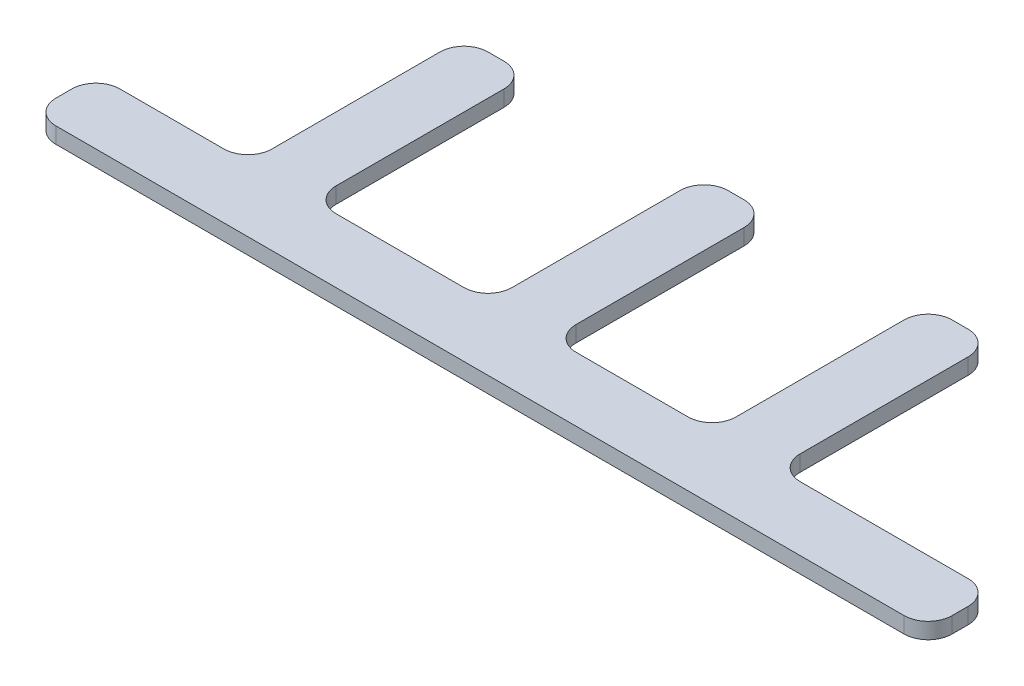
ISO-10303-21;
HEADER;
FILE_DESCRIPTION(('STEP AP214'),'2;1');
FILE_NAME('part.step','',(''),(''),'','','');
FILE_SCHEMA(('AUTOMOTIVE_DESIGN { 1 0 10303 214 1 1 1 1 }'));
ENDSEC;
DATA;
#1=APPLICATION_CONTEXT('core data for automotive mechanical design processes');
#2=APPLICATION_PROTOCOL_DEFINITION('international standard','automotive_design',2000,#1);
#3=PRODUCT_CONTEXT('',#1,'mechanical');
#4=PRODUCT('Part','Part','',(#3));
#5=PRODUCT_RELATED_PRODUCT_CATEGORY('part','',(#4));
#6=PRODUCT_DEFINITION_FORMATION('','',#4);
#7=PRODUCT_DEFINITION_CONTEXT('part definition',#1,'design');
#8=PRODUCT_DEFINITION('design','',#6,#7);
#9=PRODUCT_DEFINITION_SHAPE('','',#8);
#10=(LENGTH_UNIT() NAMED_UNIT(*) SI_UNIT(.MILLI.,.METRE.));
#11=(NAMED_UNIT(*) PLANE_ANGLE_UNIT() SI_UNIT($,.RADIAN.));
#12=(NAMED_UNIT(*) SI_UNIT($,.STERADIAN.) SOLID_ANGLE_UNIT());
#13=UNCERTAINTY_MEASURE_WITH_UNIT(LENGTH_MEASURE(1.E-05),#10,'distance_accuracy_value','');
#14=(GEOMETRIC_REPRESENTATION_CONTEXT(3) GLOBAL_UNCERTAINTY_ASSIGNED_CONTEXT((#13)) GLOBAL_UNIT_ASSIGNED_CONTEXT((#10,
#11,#12)) REPRESENTATION_CONTEXT('',''));
#15=CARTESIAN_POINT('',(0.,0.,0.));
#16=DIRECTION('',(0.,0.,1.));
#17=DIRECTION('',(1.,0.,0.));
#18=AXIS2_PLACEMENT_3D('',#15,#16,#17);
#19=CARTESIAN_POINT('',(32.,2.,-28.));
#20=DIRECTION('',(0.,-1.,0.));
#21=DIRECTION('',(0.,0.,-1.));
#22=AXIS2_PLACEMENT_3D('',#19,#20,#21);
#23=CYLINDRICAL_SURFACE('',#22,3.);
#24=CARTESIAN_POINT('',(32.,0.,-28.));
#25=DIRECTION('',(0.,1.,0.));
#26=DIRECTION('',(0.,0.,-1.));
#27=AXIS2_PLACEMENT_3D('',#24,#25,#26);
#28=CIRCLE('',#27,3.);
#29=CARTESIAN_POINT('',(35.,0.,-28.));
#30=VERTEX_POINT('',#29);
#31=CARTESIAN_POINT('',(32.,0.,-31.));
#32=VERTEX_POINT('',#31);
#33=EDGE_CURVE('E273',#30,#32,#28,.T.);
#34=ORIENTED_EDGE('',*,*,#33,.T.);
#35=DIRECTION('',(0.,-1.,0.));
#36=VECTOR('',#35,1.);
#37=CARTESIAN_POINT('',(32.,2.,-31.));
#38=LINE('',#37,#36);
#39=CARTESIAN_POINT('',(32.,2.,-31.));
#40=VERTEX_POINT('',#39);
#41=EDGE_CURVE('E11',#40,#32,#38,.T.);
#42=ORIENTED_EDGE('',*,*,#41,.F.);
#43=CARTESIAN_POINT('',(32.,2.,-28.));
#44=DIRECTION('',(0.,1.,0.));
#45=DIRECTION('',(0.,0.,-1.));
#46=AXIS2_PLACEMENT_3D('',#43,#44,#45);
#47=CIRCLE('',#46,3.);
#48=CARTESIAN_POINT('',(35.,2.,-28.));
#49=VERTEX_POINT('',#48);
#50=EDGE_CURVE('E335',#49,#40,#47,.T.);
#51=ORIENTED_EDGE('',*,*,#50,.F.);
#52=DIRECTION('',(0.,-1.,0.));
#53=VECTOR('',#52,1.);
#54=CARTESIAN_POINT('',(35.,2.,-28.));
#55=LINE('',#54,#53);
#56=EDGE_CURVE('E269',#49,#30,#55,.T.);
#57=ORIENTED_EDGE('',*,*,#56,.T.);
#58=EDGE_LOOP('',(#34,#42,#51,#57));
#59=FACE_BOUND('',#58,.T.);
#60=ADVANCED_FACE('F33',(#59),#23,.T.);
#61=CARTESIAN_POINT('',(30.,2.,-31.));
#62=DIRECTION('',(0.,0.,1.));
#63=DIRECTION('',(1.,0.,0.));
#64=AXIS2_PLACEMENT_3D('',#61,#62,#63);
#65=PLANE('',#64);
#66=DIRECTION('',(-1.,0.,0.));
#67=VECTOR('',#66,1.);
#68=CARTESIAN_POINT('',(30.,0.,-31.));
#69=LINE('',#68,#67);
#70=CARTESIAN_POINT('',(30.,0.,-31.));
#71=VERTEX_POINT('',#70);
#72=EDGE_CURVE('E276',#32,#71,#69,.T.);
#73=ORIENTED_EDGE('',*,*,#72,.T.);
#74=DIRECTION('',(0.,-1.,0.));
#75=VECTOR('',#74,1.);
#76=CARTESIAN_POINT('',(30.,2.,-31.));
#77=LINE('',#76,#75);
#78=CARTESIAN_POINT('',(30.,2.,-31.));
#79=VERTEX_POINT('',#78);
#80=EDGE_CURVE('E41',#79,#71,#77,.T.);
#81=ORIENTED_EDGE('',*,*,#80,.F.);
#82=DIRECTION('',(-1.,0.,0.));
#83=VECTOR('',#82,1.);
#84=CARTESIAN_POINT('',(30.,2.,-31.));
#85=LINE('',#84,#83);
#86=EDGE_CURVE('E164',#40,#79,#85,.T.);
#87=ORIENTED_EDGE('',*,*,#86,.F.);
#88=ORIENTED_EDGE('',*,*,#41,.T.);
#89=EDGE_LOOP('',(#73,#81,#87,#88));
#90=FACE_BOUND('',#89,.T.);
#91=ADVANCED_FACE('F513',(#90),#65,.F.);
#92=CARTESIAN_POINT('',(30.,2.,-28.));
#93=DIRECTION('',(0.,-1.,0.));
#94=DIRECTION('',(0.,0.,-1.));
#95=AXIS2_PLACEMENT_3D('',#92,#93,#94);
#96=CYLINDRICAL_SURFACE('',#95,3.);
#97=CARTESIAN_POINT('',(30.,0.,-28.));
#98=DIRECTION('',(0.,1.,0.));
#99=DIRECTION('',(0.,0.,-1.));
#100=AXIS2_PLACEMENT_3D('',#97,#98,#99);
#101=CIRCLE('',#100,3.);
#102=CARTESIAN_POINT('',(27.,0.,-28.));
#103=VERTEX_POINT('',#102);
#104=EDGE_CURVE('E278',#71,#103,#101,.T.);
#105=ORIENTED_EDGE('',*,*,#104,.T.);
#106=DIRECTION('',(0.,-1.,0.));
#107=VECTOR('',#106,1.);
#108=CARTESIAN_POINT('',(27.,2.,-28.));
#109=LINE('',#108,#107);
#110=CARTESIAN_POINT('',(27.,2.,-28.));
#111=VERTEX_POINT('',#110);
#112=EDGE_CURVE('E414',#111,#103,#109,.T.);
#113=ORIENTED_EDGE('',*,*,#112,.F.);
#114=CARTESIAN_POINT('',(30.,2.,-28.));
#115=DIRECTION('',(0.,1.,0.));
#116=DIRECTION('',(0.,0.,-1.));
#117=AXIS2_PLACEMENT_3D('',#114,#115,#116);
#118=CIRCLE('',#117,3.);
#119=EDGE_CURVE('E422',#79,#111,#118,.T.);
#120=ORIENTED_EDGE('',*,*,#119,.F.);
#121=ORIENTED_EDGE('',*,*,#80,.T.);
#122=EDGE_LOOP('',(#105,#113,#120,#121));
#123=FACE_BOUND('',#122,.T.);
#124=ADVANCED_FACE('F420',(#123),#96,.T.);
#125=CARTESIAN_POINT('',(27.,2.,-7.));
#126=DIRECTION('',(1.,0.,0.));
#127=DIRECTION('',(0.,0.,-1.));
#128=AXIS2_PLACEMENT_3D('',#125,#126,#127);
#129=PLANE('',#128);
#130=DIRECTION('',(0.,0.,1.));
#131=VECTOR('',#130,1.);
#132=CARTESIAN_POINT('',(27.,0.,-7.));
#133=LINE('',#132,#131);
#134=CARTESIAN_POINT('',(27.,0.,-7.));
#135=VERTEX_POINT('',#134);
#136=EDGE_CURVE('E280',#103,#135,#133,.T.);
#137=ORIENTED_EDGE('',*,*,#136,.T.);
#138=DIRECTION('',(0.,-1.,0.));
#139=VECTOR('',#138,1.);
#140=CARTESIAN_POINT('',(27.,2.,-7.));
#141=LINE('',#140,#139);
#142=CARTESIAN_POINT('',(27.,2.,-7.));
#143=VERTEX_POINT('',#142);
#144=EDGE_CURVE('E411',#143,#135,#141,.T.);
#145=ORIENTED_EDGE('',*,*,#144,.F.);
#146=DIRECTION('',(0.,0.,1.));
#147=VECTOR('',#146,1.);
#148=CARTESIAN_POINT('',(27.,2.,-7.));
#149=LINE('',#148,#147);
#150=EDGE_CURVE('E440',#111,#143,#149,.T.);
#151=ORIENTED_EDGE('',*,*,#150,.F.);
#152=ORIENTED_EDGE('',*,*,#112,.T.);
#153=EDGE_LOOP('',(#137,#145,#151,#152));
#154=FACE_BOUND('',#153,.T.);
#155=ADVANCED_FACE('F431',(#154),#129,.F.);
#156=CARTESIAN_POINT('',(24.,2.,-7.));
#157=DIRECTION('',(0.,-1.,0.));
#158=DIRECTION('',(0.,0.,-1.));
#159=AXIS2_PLACEMENT_3D('',#156,#157,#158);
#160=CYLINDRICAL_SURFACE('',#159,3.);
#161=CARTESIAN_POINT('',(24.,0.,-7.));
#162=DIRECTION('',(0.,-1.,0.));
#163=DIRECTION('',(0.,0.,1.));
#164=AXIS2_PLACEMENT_3D('',#161,#162,#163);
#165=CIRCLE('',#164,3.);
#166=CARTESIAN_POINT('',(24.,0.,-4.));
#167=VERTEX_POINT('',#166);
#168=EDGE_CURVE('E282',#135,#167,#165,.T.);
#169=ORIENTED_EDGE('',*,*,#168,.T.);
#170=DIRECTION('',(0.,-1.,0.));
#171=VECTOR('',#170,1.);
#172=CARTESIAN_POINT('',(24.,2.,-4.));
#173=LINE('',#172,#171);
#174=CARTESIAN_POINT('',(24.,2.,-4.));
#175=VERTEX_POINT('',#174);
#176=EDGE_CURVE('E408',#175,#167,#173,.T.);
#177=ORIENTED_EDGE('',*,*,#176,.F.);
#178=CARTESIAN_POINT('',(24.,2.,-7.));
#179=DIRECTION('',(0.,-1.,0.));
#180=DIRECTION('',(0.,0.,1.));
#181=AXIS2_PLACEMENT_3D('',#178,#179,#180);
#182=CIRCLE('',#181,3.);
#183=EDGE_CURVE('E437',#143,#175,#182,.T.);
#184=ORIENTED_EDGE('',*,*,#183,.F.);
#185=ORIENTED_EDGE('',*,*,#144,.T.);
#186=EDGE_LOOP('',(#169,#177,#184,#185));
#187=FACE_BOUND('',#186,.T.);
#188=ADVANCED_FACE('F435',(#187),#160,.F.);
#189=CARTESIAN_POINT('',(9.99999999999999,2.,-4.));
#190=DIRECTION('',(0.,0.,1.));
#191=DIRECTION('',(1.,0.,0.));
#192=AXIS2_PLACEMENT_3D('',#189,#190,#191);
#193=PLANE('',#192);
#194=DIRECTION('',(-1.,0.,0.));
#195=VECTOR('',#194,1.);
#196=CARTESIAN_POINT('',(9.99999999999999,0.,-4.));
#197=LINE('',#196,#195);
#198=CARTESIAN_POINT('',(9.99999999999999,0.,-4.));
#199=VERTEX_POINT('',#198);
#200=EDGE_CURVE('E284',#167,#199,#197,.T.);
#201=ORIENTED_EDGE('',*,*,#200,.T.);
#202=DIRECTION('',(0.,-1.,0.));
#203=VECTOR('',#202,1.);
#204=CARTESIAN_POINT('',(9.99999999999999,2.,-4.));
#205=LINE('',#204,#203);
#206=CARTESIAN_POINT('',(9.99999999999999,2.,-4.));
#207=VERTEX_POINT('',#206);
#208=EDGE_CURVE('E405',#207,#199,#205,.T.);
#209=ORIENTED_EDGE('',*,*,#208,.F.);
#210=DIRECTION('',(-1.,0.,0.));
#211=VECTOR('',#210,1.);
#212=CARTESIAN_POINT('',(9.99999999999999,2.,-4.));
#213=LINE('',#212,#211);
#214=EDGE_CURVE('E439',#175,#207,#213,.T.);
#215=ORIENTED_EDGE('',*,*,#214,.F.);
#216=ORIENTED_EDGE('',*,*,#176,.T.);
#217=EDGE_LOOP('',(#201,#209,#215,#216));
#218=FACE_BOUND('',#217,.T.);
#219=ADVANCED_FACE('F526',(#218),#193,.F.);
#220=CARTESIAN_POINT('',(9.99999999999999,2.,-7.));
#221=DIRECTION('',(0.,-1.,0.));
#222=DIRECTION('',(0.,0.,-1.));
#223=AXIS2_PLACEMENT_3D('',#220,#221,#222);
#224=CYLINDRICAL_SURFACE('',#223,3.);
#225=CARTESIAN_POINT('',(9.99999999999999,0.,-7.));
#226=DIRECTION('',(0.,-1.,0.));
#227=DIRECTION('',(0.,0.,-1.));
#228=AXIS2_PLACEMENT_3D('',#225,#226,#227);
#229=CIRCLE('',#228,3.);
#230=CARTESIAN_POINT('',(7.,0.,-7.));
#231=VERTEX_POINT('',#230);
#232=EDGE_CURVE('E286',#199,#231,#229,.T.);
#233=ORIENTED_EDGE('',*,*,#232,.T.);
#234=DIRECTION('',(0.,-1.,0.));
#235=VECTOR('',#234,1.);
#236=CARTESIAN_POINT('',(7.,2.,-7.));
#237=LINE('',#236,#235);
#238=CARTESIAN_POINT('',(7.,2.,-7.));
#239=VERTEX_POINT('',#238);
#240=EDGE_CURVE('E402',#239,#231,#237,.T.);
#241=ORIENTED_EDGE('',*,*,#240,.F.);
#242=CARTESIAN_POINT('',(9.99999999999999,2.,-7.));
#243=DIRECTION('',(0.,-1.,0.));
#244=DIRECTION('',(0.,0.,-1.));
#245=AXIS2_PLACEMENT_3D('',#242,#243,#244);
#246=CIRCLE('',#245,3.);
#247=EDGE_CURVE('E442',#207,#239,#246,.T.);
#248=ORIENTED_EDGE('',*,*,#247,.F.);
#249=ORIENTED_EDGE('',*,*,#208,.T.);
#250=EDGE_LOOP('',(#233,#241,#248,#249));
#251=FACE_BOUND('',#250,.T.);
#252=ADVANCED_FACE('F529',(#251),#224,.F.);
#253=CARTESIAN_POINT('',(7.,2.,-7.));
#254=DIRECTION('',(-1.,0.,0.));
#255=DIRECTION('',(0.,0.,1.));
#256=AXIS2_PLACEMENT_3D('',#253,#254,#255);
#257=PLANE('',#256);
#258=DIRECTION('',(0.,0.,-1.));
#259=VECTOR('',#258,1.);
#260=CARTESIAN_POINT('',(7.,0.,-7.));
#261=LINE('',#260,#259);
#262=CARTESIAN_POINT('',(7.,0.,-28.));
#263=VERTEX_POINT('',#262);
#264=EDGE_CURVE('E288',#231,#263,#261,.T.);
#265=ORIENTED_EDGE('',*,*,#264,.T.);
#266=DIRECTION('',(0.,-1.,0.));
#267=VECTOR('',#266,1.);
#268=CARTESIAN_POINT('',(7.,2.,-28.));
#269=LINE('',#268,#267);
#270=CARTESIAN_POINT('',(7.,2.,-28.));
#271=VERTEX_POINT('',#270);
#272=EDGE_CURVE('E399',#271,#263,#269,.T.);
#273=ORIENTED_EDGE('',*,*,#272,.F.);
#274=DIRECTION('',(0.,0.,-1.));
#275=VECTOR('',#274,1.);
#276=CARTESIAN_POINT('',(7.,2.,-7.));
#277=LINE('',#276,#275);
#278=EDGE_CURVE('E448',#239,#271,#277,.T.);
#279=ORIENTED_EDGE('',*,*,#278,.F.);
#280=ORIENTED_EDGE('',*,*,#240,.T.);
#281=EDGE_LOOP('',(#265,#273,#279,#280));
#282=FACE_BOUND('',#281,.T.);
#283=ADVANCED_FACE('F533',(#282),#257,.F.);
#284=CARTESIAN_POINT('',(4.,2.,-28.));
#285=DIRECTION('',(0.,-1.,0.));
#286=DIRECTION('',(0.,0.,-1.));
#287=AXIS2_PLACEMENT_3D('',#284,#285,#286);
#288=CYLINDRICAL_SURFACE('',#287,3.);
#289=CARTESIAN_POINT('',(4.,0.,-28.));
#290=DIRECTION('',(0.,1.,0.));
#291=DIRECTION('',(0.,0.,-1.));
#292=AXIS2_PLACEMENT_3D('',#289,#290,#291);
#293=CIRCLE('',#292,3.);
#294=CARTESIAN_POINT('',(4.,0.,-31.));
#295=VERTEX_POINT('',#294);
#296=EDGE_CURVE('E290',#263,#295,#293,.T.);
#297=ORIENTED_EDGE('',*,*,#296,.T.);
#298=DIRECTION('',(0.,-1.,0.));
#299=VECTOR('',#298,1.);
#300=CARTESIAN_POINT('',(4.,2.,-31.));
#301=LINE('',#300,#299);
#302=CARTESIAN_POINT('',(4.,2.,-31.));
#303=VERTEX_POINT('',#302);
#304=EDGE_CURVE('E396',#303,#295,#301,.T.);
#305=ORIENTED_EDGE('',*,*,#304,.F.);
#306=CARTESIAN_POINT('',(4.,2.,-28.));
#307=DIRECTION('',(0.,1.,0.));
#308=DIRECTION('',(0.,0.,-1.));
#309=AXIS2_PLACEMENT_3D('',#306,#307,#308);
#310=CIRCLE('',#309,3.);
#311=EDGE_CURVE('E450',#271,#303,#310,.T.);
#312=ORIENTED_EDGE('',*,*,#311,.F.);
#313=ORIENTED_EDGE('',*,*,#272,.T.);
#314=EDGE_LOOP('',(#297,#305,#312,#313));
#315=FACE_BOUND('',#314,.T.);
#316=ADVANCED_FACE('F537',(#315),#288,.T.);
#317=CARTESIAN_POINT('',(2.,2.,-31.));
#318=DIRECTION('',(0.,0.,1.));
#319=DIRECTION('',(1.,0.,0.));
#320=AXIS2_PLACEMENT_3D('',#317,#318,#319);
#321=PLANE('',#320);
#322=DIRECTION('',(-1.,0.,0.));
#323=VECTOR('',#322,1.);
#324=CARTESIAN_POINT('',(2.,0.,-31.));
#325=LINE('',#324,#323);
#326=CARTESIAN_POINT('',(2.,0.,-31.));
#327=VERTEX_POINT('',#326);
#328=EDGE_CURVE('E292',#295,#327,#325,.T.);
#329=ORIENTED_EDGE('',*,*,#328,.T.);
#330=DIRECTION('',(0.,-1.,0.));
#331=VECTOR('',#330,1.);
#332=CARTESIAN_POINT('',(2.,2.,-31.));
#333=LINE('',#332,#331);
#334=CARTESIAN_POINT('',(2.,2.,-31.));
#335=VERTEX_POINT('',#334);
#336=EDGE_CURVE('E393',#335,#327,#333,.T.);
#337=ORIENTED_EDGE('',*,*,#336,.F.);
#338=DIRECTION('',(-1.,0.,0.));
#339=VECTOR('',#338,1.);
#340=CARTESIAN_POINT('',(2.,2.,-31.));
#341=LINE('',#340,#339);
#342=EDGE_CURVE('E452',#303,#335,#341,.T.);
#343=ORIENTED_EDGE('',*,*,#342,.F.);
#344=ORIENTED_EDGE('',*,*,#304,.T.);
#345=EDGE_LOOP('',(#329,#337,#343,#344));
#346=FACE_BOUND('',#345,.T.);
#347=ADVANCED_FACE('F541',(#346),#321,.F.);
#348=CARTESIAN_POINT('',(2.,2.,-28.));
#349=DIRECTION('',(0.,-1.,0.));
#350=DIRECTION('',(0.,0.,-1.));
#351=AXIS2_PLACEMENT_3D('',#348,#349,#350);
#352=CYLINDRICAL_SURFACE('',#351,3.);
#353=CARTESIAN_POINT('',(2.,0.,-28.));
#354=DIRECTION('',(0.,1.,0.));
#355=DIRECTION('',(0.,0.,-1.));
#356=AXIS2_PLACEMENT_3D('',#353,#354,#355);
#357=CIRCLE('',#356,3.);
#358=CARTESIAN_POINT('',(-1.,0.,-28.));
#359=VERTEX_POINT('',#358);
#360=EDGE_CURVE('E294',#327,#359,#357,.T.);
#361=ORIENTED_EDGE('',*,*,#360,.T.);
#362=DIRECTION('',(0.,-1.,0.));
#363=VECTOR('',#362,1.);
#364=CARTESIAN_POINT('',(-1.,2.,-28.));
#365=LINE('',#364,#363);
#366=CARTESIAN_POINT('',(-1.,2.,-28.));
#367=VERTEX_POINT('',#366);
#368=EDGE_CURVE('E390',#367,#359,#365,.T.);
#369=ORIENTED_EDGE('',*,*,#368,.F.);
#370=CARTESIAN_POINT('',(2.,2.,-28.));
#371=DIRECTION('',(0.,1.,0.));
#372=DIRECTION('',(0.,0.,-1.));
#373=AXIS2_PLACEMENT_3D('',#370,#371,#372);
#374=CIRCLE('',#373,3.);
#375=EDGE_CURVE('E454',#335,#367,#374,.T.);
#376=ORIENTED_EDGE('',*,*,#375,.F.);
#377=ORIENTED_EDGE('',*,*,#336,.T.);
#378=EDGE_LOOP('',(#361,#369,#376,#377));
#379=FACE_BOUND('',#378,.T.);
#380=ADVANCED_FACE('F545',(#379),#352,.T.);
#381=CARTESIAN_POINT('',(-1.,2.,-7.));
#382=DIRECTION('',(1.,0.,0.));
#383=DIRECTION('',(0.,0.,-1.));
#384=AXIS2_PLACEMENT_3D('',#381,#382,#383);
#385=PLANE('',#384);
#386=DIRECTION('',(0.,0.,1.));
#387=VECTOR('',#386,1.);
#388=CARTESIAN_POINT('',(-1.,0.,-7.));
#389=LINE('',#388,#387);
#390=CARTESIAN_POINT('',(-1.,0.,-7.));
#391=VERTEX_POINT('',#390);
#392=EDGE_CURVE('E296',#359,#391,#389,.T.);
#393=ORIENTED_EDGE('',*,*,#392,.T.);
#394=DIRECTION('',(0.,-1.,0.));
#395=VECTOR('',#394,1.);
#396=CARTESIAN_POINT('',(-1.,2.,-7.));
#397=LINE('',#396,#395);
#398=CARTESIAN_POINT('',(-1.,2.,-7.));
#399=VERTEX_POINT('',#398);
#400=EDGE_CURVE('E387',#399,#391,#397,.T.);
#401=ORIENTED_EDGE('',*,*,#400,.F.);
#402=DIRECTION('',(0.,0.,1.));
#403=VECTOR('',#402,1.);
#404=CARTESIAN_POINT('',(-1.,2.,-7.));
#405=LINE('',#404,#403);
#406=EDGE_CURVE('E456',#367,#399,#405,.T.);
#407=ORIENTED_EDGE('',*,*,#406,.F.);
#408=ORIENTED_EDGE('',*,*,#368,.T.);
#409=EDGE_LOOP('',(#393,#401,#407,#408));
#410=FACE_BOUND('',#409,.T.);
#411=ADVANCED_FACE('F549',(#410),#385,.F.);
#412=CARTESIAN_POINT('',(-4.,2.,-7.));
#413=DIRECTION('',(0.,-1.,0.));
#414=DIRECTION('',(0.,0.,-1.));
#415=AXIS2_PLACEMENT_3D('',#412,#413,#414);
#416=CYLINDRICAL_SURFACE('',#415,3.);
#417=CARTESIAN_POINT('',(-4.,0.,-7.));
#418=DIRECTION('',(0.,-1.,0.));
#419=DIRECTION('',(0.,0.,1.));
#420=AXIS2_PLACEMENT_3D('',#417,#418,#419);
#421=CIRCLE('',#420,3.);
#422=CARTESIAN_POINT('',(-4.,0.,-4.));
#423=VERTEX_POINT('',#422);
#424=EDGE_CURVE('E298',#391,#423,#421,.T.);
#425=ORIENTED_EDGE('',*,*,#424,.T.);
#426=DIRECTION('',(0.,-1.,0.));
#427=VECTOR('',#426,1.);
#428=CARTESIAN_POINT('',(-4.,2.,-4.));
#429=LINE('',#428,#427);
#430=CARTESIAN_POINT('',(-4.,2.,-4.));
#431=VERTEX_POINT('',#430);
#432=EDGE_CURVE('E384',#431,#423,#429,.T.);
#433=ORIENTED_EDGE('',*,*,#432,.F.);
#434=CARTESIAN_POINT('',(-4.,2.,-7.));
#435=DIRECTION('',(0.,-1.,0.));
#436=DIRECTION('',(0.,0.,1.));
#437=AXIS2_PLACEMENT_3D('',#434,#435,#436);
#438=CIRCLE('',#437,3.);
#439=EDGE_CURVE('E458',#399,#431,#438,.T.);
#440=ORIENTED_EDGE('',*,*,#439,.F.);
#441=ORIENTED_EDGE('',*,*,#400,.T.);
#442=EDGE_LOOP('',(#425,#433,#440,#441));
#443=FACE_BOUND('',#442,.T.);
#444=ADVANCED_FACE('F553',(#443),#416,.F.);
#445=CARTESIAN_POINT('',(-20.,2.,-4.));
#446=DIRECTION('',(0.,0.,1.));
#447=DIRECTION('',(1.,0.,0.));
#448=AXIS2_PLACEMENT_3D('',#445,#446,#447);
#449=PLANE('',#448);
#450=DIRECTION('',(-1.,0.,0.));
#451=VECTOR('',#450,1.);
#452=CARTESIAN_POINT('',(-20.,0.,-4.));
#453=LINE('',#452,#451);
#454=CARTESIAN_POINT('',(-20.,0.,-4.));
#455=VERTEX_POINT('',#454);
#456=EDGE_CURVE('E300',#423,#455,#453,.T.);
#457=ORIENTED_EDGE('',*,*,#456,.T.);
#458=DIRECTION('',(0.,-1.,0.));
#459=VECTOR('',#458,1.);
#460=CARTESIAN_POINT('',(-20.,2.,-4.));
#461=LINE('',#460,#459);
#462=CARTESIAN_POINT('',(-20.,2.,-4.));
#463=VERTEX_POINT('',#462);
#464=EDGE_CURVE('E381',#463,#455,#461,.T.);
#465=ORIENTED_EDGE('',*,*,#464,.F.);
#466=DIRECTION('',(-1.,0.,0.));
#467=VECTOR('',#466,1.);
#468=CARTESIAN_POINT('',(-20.,2.,-4.));
#469=LINE('',#468,#467);
#470=EDGE_CURVE('E460',#431,#463,#469,.T.);
#471=ORIENTED_EDGE('',*,*,#470,.F.);
#472=ORIENTED_EDGE('',*,*,#432,.T.);
#473=EDGE_LOOP('',(#457,#465,#471,#472));
#474=FACE_BOUND('',#473,.T.);
#475=ADVANCED_FACE('F557',(#474),#449,.F.);
#476=CARTESIAN_POINT('',(-20.,2.,-7.));
#477=DIRECTION('',(0.,-1.,0.));
#478=DIRECTION('',(0.,0.,-1.));
#479=AXIS2_PLACEMENT_3D('',#476,#477,#478);
#480=CYLINDRICAL_SURFACE('',#479,3.);
#481=CARTESIAN_POINT('',(-20.,0.,-7.));
#482=DIRECTION('',(0.,-1.,0.));
#483=DIRECTION('',(0.,0.,-1.));
#484=AXIS2_PLACEMENT_3D('',#481,#482,#483);
#485=CIRCLE('',#484,3.);
#486=CARTESIAN_POINT('',(-23.,0.,-7.));
#487=VERTEX_POINT('',#486);
#488=EDGE_CURVE('E302',#455,#487,#485,.T.);
#489=ORIENTED_EDGE('',*,*,#488,.T.);
#490=DIRECTION('',(0.,-1.,0.));
#491=VECTOR('',#490,1.);
#492=CARTESIAN_POINT('',(-23.,2.,-7.));
#493=LINE('',#492,#491);
#494=CARTESIAN_POINT('',(-23.,2.,-7.));
#495=VERTEX_POINT('',#494);
#496=EDGE_CURVE('E378',#495,#487,#493,.T.);
#497=ORIENTED_EDGE('',*,*,#496,.F.);
#498=CARTESIAN_POINT('',(-20.,2.,-7.));
#499=DIRECTION('',(0.,-1.,0.));
#500=DIRECTION('',(0.,0.,-1.));
#501=AXIS2_PLACEMENT_3D('',#498,#499,#500);
#502=CIRCLE('',#501,3.);
#503=EDGE_CURVE('E462',#463,#495,#502,.T.);
#504=ORIENTED_EDGE('',*,*,#503,.F.);
#505=ORIENTED_EDGE('',*,*,#464,.T.);
#506=EDGE_LOOP('',(#489,#497,#504,#505));
#507=FACE_BOUND('',#506,.T.);
#508=ADVANCED_FACE('F561',(#507),#480,.F.);
#509=CARTESIAN_POINT('',(-23.,2.,-7.));
#510=DIRECTION('',(-1.,0.,0.));
#511=DIRECTION('',(0.,0.,1.));
#512=AXIS2_PLACEMENT_3D('',#509,#510,#511);
#513=PLANE('',#512);
#514=DIRECTION('',(0.,0.,-1.));
#515=VECTOR('',#514,1.);
#516=CARTESIAN_POINT('',(-23.,0.,-7.));
#517=LINE('',#516,#515);
#518=CARTESIAN_POINT('',(-23.,0.,-28.));
#519=VERTEX_POINT('',#518);
#520=EDGE_CURVE('E304',#487,#519,#517,.T.);
#521=ORIENTED_EDGE('',*,*,#520,.T.);
#522=DIRECTION('',(0.,-1.,0.));
#523=VECTOR('',#522,1.);
#524=CARTESIAN_POINT('',(-23.,2.,-28.));
#525=LINE('',#524,#523);
#526=CARTESIAN_POINT('',(-23.,2.,-28.));
#527=VERTEX_POINT('',#526);
#528=EDGE_CURVE('E375',#527,#519,#525,.T.);
#529=ORIENTED_EDGE('',*,*,#528,.F.);
#530=DIRECTION('',(0.,0.,-1.));
#531=VECTOR('',#530,1.);
#532=CARTESIAN_POINT('',(-23.,2.,-7.));
#533=LINE('',#532,#531);
#534=EDGE_CURVE('E464',#495,#527,#533,.T.);
#535=ORIENTED_EDGE('',*,*,#534,.F.);
#536=ORIENTED_EDGE('',*,*,#496,.T.);
#537=EDGE_LOOP('',(#521,#529,#535,#536));
#538=FACE_BOUND('',#537,.T.);
#539=ADVANCED_FACE('F565',(#538),#513,.F.);
#540=CARTESIAN_POINT('',(-26.,2.,-28.));
#541=DIRECTION('',(0.,-1.,0.));
#542=DIRECTION('',(0.,0.,-1.));
#543=AXIS2_PLACEMENT_3D('',#540,#541,#542);
#544=CYLINDRICAL_SURFACE('',#543,3.);
#545=CARTESIAN_POINT('',(-26.,0.,-28.));
#546=DIRECTION('',(0.,1.,0.));
#547=DIRECTION('',(0.,0.,-1.));
#548=AXIS2_PLACEMENT_3D('',#545,#546,#547);
#549=CIRCLE('',#548,3.);
#550=CARTESIAN_POINT('',(-26.,0.,-31.));
#551=VERTEX_POINT('',#550);
#552=EDGE_CURVE('E306',#519,#551,#549,.T.);
#553=ORIENTED_EDGE('',*,*,#552,.T.);
#554=DIRECTION('',(0.,-1.,0.));
#555=VECTOR('',#554,1.);
#556=CARTESIAN_POINT('',(-26.,2.,-31.));
#557=LINE('',#556,#555);
#558=CARTESIAN_POINT('',(-26.,2.,-31.));
#559=VERTEX_POINT('',#558);
#560=EDGE_CURVE('E372',#559,#551,#557,.T.);
#561=ORIENTED_EDGE('',*,*,#560,.F.);
#562=CARTESIAN_POINT('',(-26.,2.,-28.));
#563=DIRECTION('',(0.,1.,0.));
#564=DIRECTION('',(0.,0.,-1.));
#565=AXIS2_PLACEMENT_3D('',#562,#563,#564);
#566=CIRCLE('',#565,3.);
#567=EDGE_CURVE('E466',#527,#559,#566,.T.);
#568=ORIENTED_EDGE('',*,*,#567,.F.);
#569=ORIENTED_EDGE('',*,*,#528,.T.);
#570=EDGE_LOOP('',(#553,#561,#568,#569));
#571=FACE_BOUND('',#570,.T.);
#572=ADVANCED_FACE('F569',(#571),#544,.T.);
#573=CARTESIAN_POINT('',(-28.,2.,-31.));
#574=DIRECTION('',(0.,0.,1.));
#575=DIRECTION('',(1.,0.,0.));
#576=AXIS2_PLACEMENT_3D('',#573,#574,#575);
#577=PLANE('',#576);
#578=DIRECTION('',(-1.,0.,0.));
#579=VECTOR('',#578,1.);
#580=CARTESIAN_POINT('',(-28.,0.,-31.));
#581=LINE('',#580,#579);
#582=CARTESIAN_POINT('',(-28.,0.,-31.));
#583=VERTEX_POINT('',#582);
#584=EDGE_CURVE('E308',#551,#583,#581,.T.);
#585=ORIENTED_EDGE('',*,*,#584,.T.);
#586=DIRECTION('',(0.,-1.,0.));
#587=VECTOR('',#586,1.);
#588=CARTESIAN_POINT('',(-28.,2.,-31.));
#589=LINE('',#588,#587);
#590=CARTESIAN_POINT('',(-28.,2.,-31.));
#591=VERTEX_POINT('',#590);
#592=EDGE_CURVE('E369',#591,#583,#589,.T.);
#593=ORIENTED_EDGE('',*,*,#592,.F.);
#594=DIRECTION('',(-1.,0.,0.));
#595=VECTOR('',#594,1.);
#596=CARTESIAN_POINT('',(-28.,2.,-31.));
#597=LINE('',#596,#595);
#598=EDGE_CURVE('E468',#559,#591,#597,.T.);
#599=ORIENTED_EDGE('',*,*,#598,.F.);
#600=ORIENTED_EDGE('',*,*,#560,.T.);
#601=EDGE_LOOP('',(#585,#593,#599,#600));
#602=FACE_BOUND('',#601,.T.);
#603=ADVANCED_FACE('F573',(#602),#577,.F.);
#604=CARTESIAN_POINT('',(-28.,2.,-28.));
#605=DIRECTION('',(0.,-1.,0.));
#606=DIRECTION('',(0.,0.,-1.));
#607=AXIS2_PLACEMENT_3D('',#604,#605,#606);
#608=CYLINDRICAL_SURFACE('',#607,3.);
#609=CARTESIAN_POINT('',(-28.,0.,-28.));
#610=DIRECTION('',(0.,1.,0.));
#611=DIRECTION('',(0.,0.,-1.));
#612=AXIS2_PLACEMENT_3D('',#609,#610,#611);
#613=CIRCLE('',#612,3.);
#614=CARTESIAN_POINT('',(-31.,0.,-28.));
#615=VERTEX_POINT('',#614);
#616=EDGE_CURVE('E310',#583,#615,#613,.T.);
#617=ORIENTED_EDGE('',*,*,#616,.T.);
#618=DIRECTION('',(0.,-1.,0.));
#619=VECTOR('',#618,1.);
#620=CARTESIAN_POINT('',(-31.,2.,-28.));
#621=LINE('',#620,#619);
#622=CARTESIAN_POINT('',(-31.,2.,-28.));
#623=VERTEX_POINT('',#622);
#624=EDGE_CURVE('E366',#623,#615,#621,.T.);
#625=ORIENTED_EDGE('',*,*,#624,.F.);
#626=CARTESIAN_POINT('',(-28.,2.,-28.));
#627=DIRECTION('',(0.,1.,0.));
#628=DIRECTION('',(0.,0.,-1.));
#629=AXIS2_PLACEMENT_3D('',#626,#627,#628);
#630=CIRCLE('',#629,3.);
#631=EDGE_CURVE('E470',#591,#623,#630,.T.);
#632=ORIENTED_EDGE('',*,*,#631,.F.);
#633=ORIENTED_EDGE('',*,*,#592,.T.);
#634=EDGE_LOOP('',(#617,#625,#632,#633));
#635=FACE_BOUND('',#634,.T.);
#636=ADVANCED_FACE('F577',(#635),#608,.T.);
#637=CARTESIAN_POINT('',(-31.,2.,-7.));
#638=DIRECTION('',(1.,0.,0.));
#639=DIRECTION('',(0.,0.,-1.));
#640=AXIS2_PLACEMENT_3D('',#637,#638,#639);
#641=PLANE('',#640);
#642=DIRECTION('',(0.,0.,1.));
#643=VECTOR('',#642,1.);
#644=CARTESIAN_POINT('',(-31.,0.,-7.));
#645=LINE('',#644,#643);
#646=CARTESIAN_POINT('',(-31.,0.,-7.));
#647=VERTEX_POINT('',#646);
#648=EDGE_CURVE('E312',#615,#647,#645,.T.);
#649=ORIENTED_EDGE('',*,*,#648,.T.);
#650=DIRECTION('',(0.,-1.,0.));
#651=VECTOR('',#650,1.);
#652=CARTESIAN_POINT('',(-31.,2.,-7.));
#653=LINE('',#652,#651);
#654=CARTESIAN_POINT('',(-31.,2.,-7.));
#655=VERTEX_POINT('',#654);
#656=EDGE_CURVE('E363',#655,#647,#653,.T.);
#657=ORIENTED_EDGE('',*,*,#656,.F.);
#658=DIRECTION('',(0.,0.,1.));
#659=VECTOR('',#658,1.);
#660=CARTESIAN_POINT('',(-31.,2.,-7.));
#661=LINE('',#660,#659);
#662=EDGE_CURVE('E472',#623,#655,#661,.T.);
#663=ORIENTED_EDGE('',*,*,#662,.F.);
#664=ORIENTED_EDGE('',*,*,#624,.T.);
#665=EDGE_LOOP('',(#649,#657,#663,#664));
#666=FACE_BOUND('',#665,.T.);
#667=ADVANCED_FACE('F581',(#666),#641,.F.);
#668=CARTESIAN_POINT('',(-34.,2.,-7.));
#669=DIRECTION('',(0.,-1.,0.));
#670=DIRECTION('',(0.,0.,-1.));
#671=AXIS2_PLACEMENT_3D('',#668,#669,#670);
#672=CYLINDRICAL_SURFACE('',#671,3.);
#673=CARTESIAN_POINT('',(-34.,0.,-7.));
#674=DIRECTION('',(0.,-1.,0.));
#675=DIRECTION('',(0.,0.,1.));
#676=AXIS2_PLACEMENT_3D('',#673,#674,#675);
#677=CIRCLE('',#676,3.);
#678=CARTESIAN_POINT('',(-34.,0.,-4.));
#679=VERTEX_POINT('',#678);
#680=EDGE_CURVE('E314',#647,#679,#677,.T.);
#681=ORIENTED_EDGE('',*,*,#680,.T.);
#682=DIRECTION('',(0.,-1.,0.));
#683=VECTOR('',#682,1.);
#684=CARTESIAN_POINT('',(-34.,2.,-4.));
#685=LINE('',#684,#683);
#686=CARTESIAN_POINT('',(-34.,2.,-4.));
#687=VERTEX_POINT('',#686);
#688=EDGE_CURVE('E360',#687,#679,#685,.T.);
#689=ORIENTED_EDGE('',*,*,#688,.F.);
#690=CARTESIAN_POINT('',(-34.,2.,-7.));
#691=DIRECTION('',(0.,-1.,0.));
#692=DIRECTION('',(0.,0.,1.));
#693=AXIS2_PLACEMENT_3D('',#690,#691,#692);
#694=CIRCLE('',#693,3.);
#695=EDGE_CURVE('E474',#655,#687,#694,.T.);
#696=ORIENTED_EDGE('',*,*,#695,.F.);
#697=ORIENTED_EDGE('',*,*,#656,.T.);
#698=EDGE_LOOP('',(#681,#689,#696,#697));
#699=FACE_BOUND('',#698,.T.);
#700=ADVANCED_FACE('F585',(#699),#672,.F.);
#701=CARTESIAN_POINT('',(-47.,2.,-4.));
#702=DIRECTION('',(0.,0.,1.));
#703=DIRECTION('',(1.,0.,0.));
#704=AXIS2_PLACEMENT_3D('',#701,#702,#703);
#705=PLANE('',#704);
#706=DIRECTION('',(-1.,0.,0.));
#707=VECTOR('',#706,1.);
#708=CARTESIAN_POINT('',(-47.,0.,-4.));
#709=LINE('',#708,#707);
#710=CARTESIAN_POINT('',(-47.,0.,-4.));
#711=VERTEX_POINT('',#710);
#712=EDGE_CURVE('E316',#679,#711,#709,.T.);
#713=ORIENTED_EDGE('',*,*,#712,.T.);
#714=DIRECTION('',(0.,-1.,0.));
#715=VECTOR('',#714,1.);
#716=CARTESIAN_POINT('',(-47.,2.,-4.));
#717=LINE('',#716,#715);
#718=CARTESIAN_POINT('',(-47.,2.,-4.));
#719=VERTEX_POINT('',#718);
#720=EDGE_CURVE('E357',#719,#711,#717,.T.);
#721=ORIENTED_EDGE('',*,*,#720,.F.);
#722=DIRECTION('',(-1.,0.,0.));
#723=VECTOR('',#722,1.);
#724=CARTESIAN_POINT('',(-47.,2.,-4.));
#725=LINE('',#724,#723);
#726=EDGE_CURVE('E476',#687,#719,#725,.T.);
#727=ORIENTED_EDGE('',*,*,#726,.F.);
#728=ORIENTED_EDGE('',*,*,#688,.T.);
#729=EDGE_LOOP('',(#713,#721,#727,#728));
#730=FACE_BOUND('',#729,.T.);
#731=ADVANCED_FACE('F589',(#730),#705,.F.);
#732=CARTESIAN_POINT('',(-47.,2.,-1.));
#733=DIRECTION('',(0.,-1.,0.));
#734=DIRECTION('',(0.,0.,-1.));
#735=AXIS2_PLACEMENT_3D('',#732,#733,#734);
#736=CYLINDRICAL_SURFACE('',#735,3.);
#737=CARTESIAN_POINT('',(-47.,0.,-1.));
#738=DIRECTION('',(0.,1.,0.));
#739=DIRECTION('',(0.,0.,1.));
#740=AXIS2_PLACEMENT_3D('',#737,#738,#739);
#741=CIRCLE('',#740,3.);
#742=CARTESIAN_POINT('',(-50.,0.,-0.99999999999998));
#743=VERTEX_POINT('',#742);
#744=EDGE_CURVE('E318',#711,#743,#741,.T.);
#745=ORIENTED_EDGE('',*,*,#744,.T.);
#746=DIRECTION('',(0.,-1.,0.));
#747=VECTOR('',#746,1.);
#748=CARTESIAN_POINT('',(-50.,2.,-0.99999999999998));
#749=LINE('',#748,#747);
#750=CARTESIAN_POINT('',(-50.,2.,-0.99999999999998));
#751=VERTEX_POINT('',#750);
#752=EDGE_CURVE('E354',#751,#743,#749,.T.);
#753=ORIENTED_EDGE('',*,*,#752,.F.);
#754=CARTESIAN_POINT('',(-47.,2.,-1.));
#755=DIRECTION('',(0.,1.,0.));
#756=DIRECTION('',(0.,0.,1.));
#757=AXIS2_PLACEMENT_3D('',#754,#755,#756);
#758=CIRCLE('',#757,3.);
#759=EDGE_CURVE('E478',#719,#751,#758,.T.);
#760=ORIENTED_EDGE('',*,*,#759,.F.);
#761=ORIENTED_EDGE('',*,*,#720,.T.);
#762=EDGE_LOOP('',(#745,#753,#760,#761));
#763=FACE_BOUND('',#762,.T.);
#764=ADVANCED_FACE('F593',(#763),#736,.T.);
#765=CARTESIAN_POINT('',(-50.,2.,-0.99999999999998));
#766=DIRECTION('',(1.,0.,0.));
#767=DIRECTION('',(0.,0.,-1.));
#768=AXIS2_PLACEMENT_3D('',#765,#766,#767);
#769=PLANE('',#768);
#770=DIRECTION('',(0.,0.,1.));
#771=VECTOR('',#770,1.);
#772=CARTESIAN_POINT('',(-50.,0.,-0.99999999999998));
#773=LINE('',#772,#771);
#774=CARTESIAN_POINT('',(-50.,0.,0.999999999999978));
#775=VERTEX_POINT('',#774);
#776=EDGE_CURVE('E320',#743,#775,#773,.T.);
#777=ORIENTED_EDGE('',*,*,#776,.T.);
#778=DIRECTION('',(0.,-1.,0.));
#779=VECTOR('',#778,1.);
#780=CARTESIAN_POINT('',(-50.,2.,0.999999999999978));
#781=LINE('',#780,#779);
#782=CARTESIAN_POINT('',(-50.,2.,0.999999999999978));
#783=VERTEX_POINT('',#782);
#784=EDGE_CURVE('E351',#783,#775,#781,.T.);
#785=ORIENTED_EDGE('',*,*,#784,.F.);
#786=DIRECTION('',(0.,0.,1.));
#787=VECTOR('',#786,1.);
#788=CARTESIAN_POINT('',(-50.,2.,-0.99999999999998));
#789=LINE('',#788,#787);
#790=EDGE_CURVE('E480',#751,#783,#789,.T.);
#791=ORIENTED_EDGE('',*,*,#790,.F.);
#792=ORIENTED_EDGE('',*,*,#752,.T.);
#793=EDGE_LOOP('',(#777,#785,#791,#792));
#794=FACE_BOUND('',#793,.T.);
#795=ADVANCED_FACE('F597',(#794),#769,.F.);
#796=CARTESIAN_POINT('',(-47.,2.,0.999999999999999));
#797=DIRECTION('',(0.,-1.,0.));
#798=DIRECTION('',(0.,0.,-1.));
#799=AXIS2_PLACEMENT_3D('',#796,#797,#798);
#800=CYLINDRICAL_SURFACE('',#799,3.);
#801=CARTESIAN_POINT('',(-47.,0.,0.999999999999999));
#802=DIRECTION('',(0.,1.,0.));
#803=DIRECTION('',(0.,0.,1.));
#804=AXIS2_PLACEMENT_3D('',#801,#802,#803);
#805=CIRCLE('',#804,3.);
#806=CARTESIAN_POINT('',(-47.,0.,4.));
#807=VERTEX_POINT('',#806);
#808=EDGE_CURVE('E322',#775,#807,#805,.T.);
#809=ORIENTED_EDGE('',*,*,#808,.T.);
#810=DIRECTION('',(0.,-1.,0.));
#811=VECTOR('',#810,1.);
#812=CARTESIAN_POINT('',(-47.,2.,4.));
#813=LINE('',#812,#811);
#814=CARTESIAN_POINT('',(-47.,2.,4.));
#815=VERTEX_POINT('',#814);
#816=EDGE_CURVE('E348',#815,#807,#813,.T.);
#817=ORIENTED_EDGE('',*,*,#816,.F.);
#818=CARTESIAN_POINT('',(-47.,2.,0.999999999999999));
#819=DIRECTION('',(0.,1.,0.));
#820=DIRECTION('',(0.,0.,1.));
#821=AXIS2_PLACEMENT_3D('',#818,#819,#820);
#822=CIRCLE('',#821,3.);
#823=EDGE_CURVE('E482',#783,#815,#822,.T.);
#824=ORIENTED_EDGE('',*,*,#823,.F.);
#825=ORIENTED_EDGE('',*,*,#784,.T.);
#826=EDGE_LOOP('',(#809,#817,#824,#825));
#827=FACE_BOUND('',#826,.T.);
#828=ADVANCED_FACE('F601',(#827),#800,.T.);
#829=CARTESIAN_POINT('',(-47.,2.,4.));
#830=DIRECTION('',(0.,0.,-1.));
#831=DIRECTION('',(-1.,0.,0.));
#832=AXIS2_PLACEMENT_3D('',#829,#830,#831);
#833=PLANE('',#832);
#834=DIRECTION('',(1.,0.,0.));
#835=VECTOR('',#834,1.);
#836=CARTESIAN_POINT('',(-47.,0.,4.));
#837=LINE('',#836,#835);
#838=CARTESIAN_POINT('',(59.,0.,4.));
#839=VERTEX_POINT('',#838);
#840=EDGE_CURVE('E324',#807,#839,#837,.T.);
#841=ORIENTED_EDGE('',*,*,#840,.T.);
#842=DIRECTION('',(0.,-1.,0.));
#843=VECTOR('',#842,1.);
#844=CARTESIAN_POINT('',(59.,2.,4.));
#845=LINE('',#844,#843);
#846=CARTESIAN_POINT('',(59.,2.,4.));
#847=VERTEX_POINT('',#846);
#848=EDGE_CURVE('E345',#847,#839,#845,.T.);
#849=ORIENTED_EDGE('',*,*,#848,.F.);
#850=DIRECTION('',(1.,0.,0.));
#851=VECTOR('',#850,1.);
#852=CARTESIAN_POINT('',(-47.,2.,4.));
#853=LINE('',#852,#851);
#854=EDGE_CURVE('E484',#815,#847,#853,.T.);
#855=ORIENTED_EDGE('',*,*,#854,.F.);
#856=ORIENTED_EDGE('',*,*,#816,.T.);
#857=EDGE_LOOP('',(#841,#849,#855,#856));
#858=FACE_BOUND('',#857,.T.);
#859=ADVANCED_FACE('F605',(#858),#833,.F.);
#860=CARTESIAN_POINT('',(59.,2.,1.));
#861=DIRECTION('',(0.,-1.,0.));
#862=DIRECTION('',(0.,0.,-1.));
#863=AXIS2_PLACEMENT_3D('',#860,#861,#862);
#864=CYLINDRICAL_SURFACE('',#863,3.);
#865=CARTESIAN_POINT('',(59.,0.,1.));
#866=DIRECTION('',(0.,1.,0.));
#867=DIRECTION('',(0.,0.,1.));
#868=AXIS2_PLACEMENT_3D('',#865,#866,#867);
#869=CIRCLE('',#868,3.);
#870=CARTESIAN_POINT('',(62.,0.,1.));
#871=VERTEX_POINT('',#870);
#872=EDGE_CURVE('E326',#839,#871,#869,.T.);
#873=ORIENTED_EDGE('',*,*,#872,.T.);
#874=DIRECTION('',(0.,-1.,0.));
#875=VECTOR('',#874,1.);
#876=CARTESIAN_POINT('',(62.,2.,1.));
#877=LINE('',#876,#875);
#878=CARTESIAN_POINT('',(62.,2.,1.));
#879=VERTEX_POINT('',#878);
#880=EDGE_CURVE('E342',#879,#871,#877,.T.);
#881=ORIENTED_EDGE('',*,*,#880,.F.);
#882=CARTESIAN_POINT('',(59.,2.,1.));
#883=DIRECTION('',(0.,1.,0.));
#884=DIRECTION('',(0.,0.,1.));
#885=AXIS2_PLACEMENT_3D('',#882,#883,#884);
#886=CIRCLE('',#885,3.);
#887=EDGE_CURVE('E486',#847,#879,#886,.T.);
#888=ORIENTED_EDGE('',*,*,#887,.F.);
#889=ORIENTED_EDGE('',*,*,#848,.T.);
#890=EDGE_LOOP('',(#873,#881,#888,#889));
#891=FACE_BOUND('',#890,.T.);
#892=ADVANCED_FACE('F609',(#891),#864,.T.);
#893=CARTESIAN_POINT('',(62.,2.,-1.));
#894=DIRECTION('',(-1.,0.,0.));
#895=DIRECTION('',(0.,0.,1.));
#896=AXIS2_PLACEMENT_3D('',#893,#894,#895);
#897=PLANE('',#896);
#898=DIRECTION('',(0.,0.,-1.));
#899=VECTOR('',#898,1.);
#900=CARTESIAN_POINT('',(62.,0.,-1.));
#901=LINE('',#900,#899);
#902=CARTESIAN_POINT('',(62.,0.,-1.));
#903=VERTEX_POINT('',#902);
#904=EDGE_CURVE('E328',#871,#903,#901,.T.);
#905=ORIENTED_EDGE('',*,*,#904,.T.);
#906=DIRECTION('',(0.,-1.,0.));
#907=VECTOR('',#906,1.);
#908=CARTESIAN_POINT('',(62.,2.,-1.));
#909=LINE('',#908,#907);
#910=CARTESIAN_POINT('',(62.,2.,-1.));
#911=VERTEX_POINT('',#910);
#912=EDGE_CURVE('E339',#911,#903,#909,.T.);
#913=ORIENTED_EDGE('',*,*,#912,.F.);
#914=DIRECTION('',(0.,0.,-1.));
#915=VECTOR('',#914,1.);
#916=CARTESIAN_POINT('',(62.,2.,-1.));
#917=LINE('',#916,#915);
#918=EDGE_CURVE('E488',#879,#911,#917,.T.);
#919=ORIENTED_EDGE('',*,*,#918,.F.);
#920=ORIENTED_EDGE('',*,*,#880,.T.);
#921=EDGE_LOOP('',(#905,#913,#919,#920));
#922=FACE_BOUND('',#921,.T.);
#923=ADVANCED_FACE('F494',(#922),#897,.F.);
#924=CARTESIAN_POINT('',(59.,2.,-0.999999999999999));
#925=DIRECTION('',(0.,-1.,0.));
#926=DIRECTION('',(0.,0.,-1.));
#927=AXIS2_PLACEMENT_3D('',#924,#925,#926);
#928=CYLINDRICAL_SURFACE('',#927,3.);
#929=CARTESIAN_POINT('',(59.,0.,-0.999999999999999));
#930=DIRECTION('',(0.,1.,0.));
#931=DIRECTION('',(0.,0.,-1.));
#932=AXIS2_PLACEMENT_3D('',#929,#930,#931);
#933=CIRCLE('',#932,3.);
#934=CARTESIAN_POINT('',(59.,0.,-4.));
#935=VERTEX_POINT('',#934);
#936=EDGE_CURVE('E330',#903,#935,#933,.T.);
#937=ORIENTED_EDGE('',*,*,#936,.T.);
#938=DIRECTION('',(0.,-1.,0.));
#939=VECTOR('',#938,1.);
#940=CARTESIAN_POINT('',(59.,2.,-4.));
#941=LINE('',#940,#939);
#942=CARTESIAN_POINT('',(59.,2.,-4.));
#943=VERTEX_POINT('',#942);
#944=EDGE_CURVE('E264',#943,#935,#941,.T.);
#945=ORIENTED_EDGE('',*,*,#944,.F.);
#946=CARTESIAN_POINT('',(59.,2.,-0.999999999999999));
#947=DIRECTION('',(0.,1.,0.));
#948=DIRECTION('',(0.,0.,-1.));
#949=AXIS2_PLACEMENT_3D('',#946,#947,#948);
#950=CIRCLE('',#949,3.);
#951=EDGE_CURVE('E255',#911,#943,#950,.T.);
#952=ORIENTED_EDGE('',*,*,#951,.F.);
#953=ORIENTED_EDGE('',*,*,#912,.T.);
#954=EDGE_LOOP('',(#937,#945,#952,#953));
#955=FACE_BOUND('',#954,.T.);
#956=ADVANCED_FACE('F498',(#955),#928,.T.);
#957=CARTESIAN_POINT('',(38.,2.,-4.));
#958=DIRECTION('',(0.,0.,1.));
#959=DIRECTION('',(1.,0.,0.));
#960=AXIS2_PLACEMENT_3D('',#957,#958,#959);
#961=PLANE('',#960);
#962=DIRECTION('',(-1.,0.,0.));
#963=VECTOR('',#962,1.);
#964=CARTESIAN_POINT('',(38.,0.,-4.));
#965=LINE('',#964,#963);
#966=CARTESIAN_POINT('',(38.,0.,-4.));
#967=VERTEX_POINT('',#966);
#968=EDGE_CURVE('E263',#935,#967,#965,.T.);
#969=ORIENTED_EDGE('',*,*,#968,.T.);
#970=DIRECTION('',(0.,-1.,0.));
#971=VECTOR('',#970,1.);
#972=CARTESIAN_POINT('',(38.,2.,-4.));
#973=LINE('',#972,#971);
#974=CARTESIAN_POINT('',(38.,2.,-4.));
#975=VERTEX_POINT('',#974);
#976=EDGE_CURVE('E260',#975,#967,#973,.T.);
#977=ORIENTED_EDGE('',*,*,#976,.F.);
#978=DIRECTION('',(-1.,0.,0.));
#979=VECTOR('',#978,1.);
#980=CARTESIAN_POINT('',(38.,2.,-4.));
#981=LINE('',#980,#979);
#982=EDGE_CURVE('E249',#943,#975,#981,.T.);
#983=ORIENTED_EDGE('',*,*,#982,.F.);
#984=ORIENTED_EDGE('',*,*,#944,.T.);
#985=EDGE_LOOP('',(#969,#977,#983,#984));
#986=FACE_BOUND('',#985,.T.);
#987=ADVANCED_FACE('F261',(#986),#961,.F.);
#988=CARTESIAN_POINT('',(38.,2.,-7.));
#989=DIRECTION('',(0.,-1.,0.));
#990=DIRECTION('',(0.,0.,-1.));
#991=AXIS2_PLACEMENT_3D('',#988,#989,#990);
#992=CYLINDRICAL_SURFACE('',#991,3.);
#993=CARTESIAN_POINT('',(38.,0.,-7.));
#994=DIRECTION('',(0.,-1.,0.));
#995=DIRECTION('',(0.,0.,-1.));
#996=AXIS2_PLACEMENT_3D('',#993,#994,#995);
#997=CIRCLE('',#996,3.);
#998=CARTESIAN_POINT('',(35.,0.,-7.));
#999=VERTEX_POINT('',#998);
#1000=EDGE_CURVE('E150',#967,#999,#997,.T.);
#1001=ORIENTED_EDGE('',*,*,#1000,.T.);
#1002=DIRECTION('',(0.,-1.,0.));
#1003=VECTOR('',#1002,1.);
#1004=CARTESIAN_POINT('',(35.,2.,-7.));
#1005=LINE('',#1004,#1003);
#1006=CARTESIAN_POINT('',(35.,2.,-7.));
#1007=VERTEX_POINT('',#1006);
#1008=EDGE_CURVE('E265',#1007,#999,#1005,.T.);
#1009=ORIENTED_EDGE('',*,*,#1008,.F.);
#1010=CARTESIAN_POINT('',(38.,2.,-7.));
#1011=DIRECTION('',(0.,-1.,0.));
#1012=DIRECTION('',(0.,0.,-1.));
#1013=AXIS2_PLACEMENT_3D('',#1010,#1011,#1012);
#1014=CIRCLE('',#1013,3.);
#1015=EDGE_CURVE('E253',#975,#1007,#1014,.T.);
#1016=ORIENTED_EDGE('',*,*,#1015,.F.);
#1017=ORIENTED_EDGE('',*,*,#976,.T.);
#1018=EDGE_LOOP('',(#1001,#1009,#1016,#1017));
#1019=FACE_BOUND('',#1018,.T.);
#1020=ADVANCED_FACE('F267',(#1019),#992,.F.);
#1021=CARTESIAN_POINT('',(35.,2.,-7.));
#1022=DIRECTION('',(-1.,0.,0.));
#1023=DIRECTION('',(0.,0.,1.));
#1024=AXIS2_PLACEMENT_3D('',#1021,#1022,#1023);
#1025=PLANE('',#1024);
#1026=DIRECTION('',(0.,0.,-1.));
#1027=VECTOR('',#1026,1.);
#1028=CARTESIAN_POINT('',(35.,0.,-7.));
#1029=LINE('',#1028,#1027);
#1030=EDGE_CURVE('E156',#999,#30,#1029,.T.);
#1031=ORIENTED_EDGE('',*,*,#1030,.T.);
#1032=ORIENTED_EDGE('',*,*,#56,.F.);
#1033=DIRECTION('',(0.,0.,-1.));
#1034=VECTOR('',#1033,1.);
#1035=CARTESIAN_POINT('',(35.,2.,-7.));
#1036=LINE('',#1035,#1034);
#1037=EDGE_CURVE('E49',#1007,#49,#1036,.T.);
#1038=ORIENTED_EDGE('',*,*,#1037,.F.);
#1039=ORIENTED_EDGE('',*,*,#1008,.T.);
#1040=EDGE_LOOP('',(#1031,#1032,#1038,#1039));
#1041=FACE_BOUND('',#1040,.T.);
#1042=ADVANCED_FACE('F502',(#1041),#1025,.F.);
#1043=CARTESIAN_POINT('',(32.,2.,-28.));
#1044=DIRECTION('',(0.,-1.,0.));
#1045=DIRECTION('',(0.,0.,-1.));
#1046=AXIS2_PLACEMENT_3D('',#1043,#1044,#1045);
#1047=PLANE('',#1046);
#1048=ORIENTED_EDGE('',*,*,#50,.T.);
#1049=ORIENTED_EDGE('',*,*,#86,.T.);
#1050=ORIENTED_EDGE('',*,*,#119,.T.);
#1051=ORIENTED_EDGE('',*,*,#150,.T.);
#1052=ORIENTED_EDGE('',*,*,#183,.T.);
#1053=ORIENTED_EDGE('',*,*,#214,.T.);
#1054=ORIENTED_EDGE('',*,*,#247,.T.);
#1055=ORIENTED_EDGE('',*,*,#278,.T.);
#1056=ORIENTED_EDGE('',*,*,#311,.T.);
#1057=ORIENTED_EDGE('',*,*,#342,.T.);
#1058=ORIENTED_EDGE('',*,*,#375,.T.);
#1059=ORIENTED_EDGE('',*,*,#406,.T.);
#1060=ORIENTED_EDGE('',*,*,#439,.T.);
#1061=ORIENTED_EDGE('',*,*,#470,.T.);
#1062=ORIENTED_EDGE('',*,*,#503,.T.);
#1063=ORIENTED_EDGE('',*,*,#534,.T.);
#1064=ORIENTED_EDGE('',*,*,#567,.T.);
#1065=ORIENTED_EDGE('',*,*,#598,.T.);
#1066=ORIENTED_EDGE('',*,*,#631,.T.);
#1067=ORIENTED_EDGE('',*,*,#662,.T.);
#1068=ORIENTED_EDGE('',*,*,#695,.T.);
#1069=ORIENTED_EDGE('',*,*,#726,.T.);
#1070=ORIENTED_EDGE('',*,*,#759,.T.);
#1071=ORIENTED_EDGE('',*,*,#790,.T.);
#1072=ORIENTED_EDGE('',*,*,#823,.T.);
#1073=ORIENTED_EDGE('',*,*,#854,.T.);
#1074=ORIENTED_EDGE('',*,*,#887,.T.);
#1075=ORIENTED_EDGE('',*,*,#918,.T.);
#1076=ORIENTED_EDGE('',*,*,#951,.T.);
#1077=ORIENTED_EDGE('',*,*,#982,.T.);
#1078=ORIENTED_EDGE('',*,*,#1015,.T.);
#1079=ORIENTED_EDGE('',*,*,#1037,.T.);
#1080=EDGE_LOOP('',(#1048,#1049,#1050,#1051,#1052,#1053,#1054,#1055,#1056,#1057,#1058,#1059,
#1060,#1061,#1062,#1063,#1064,#1065,#1066,#1067,#1068,#1069,#1070,#1071,#1072,#1073,#1074,#1075,
#1076,#1077,#1078,#1079));
#1081=FACE_BOUND('',#1080,.T.);
#1082=ADVANCED_FACE('F251',(#1081),#1047,.F.);
#1083=CARTESIAN_POINT('',(32.,0.,-28.));
#1084=DIRECTION('',(0.,-1.,0.));
#1085=DIRECTION('',(0.,0.,-1.));
#1086=AXIS2_PLACEMENT_3D('',#1083,#1084,#1085);
#1087=PLANE('',#1086);
#1088=ORIENTED_EDGE('',*,*,#33,.F.);
#1089=ORIENTED_EDGE('',*,*,#1030,.F.);
#1090=ORIENTED_EDGE('',*,*,#1000,.F.);
#1091=ORIENTED_EDGE('',*,*,#968,.F.);
#1092=ORIENTED_EDGE('',*,*,#936,.F.);
#1093=ORIENTED_EDGE('',*,*,#904,.F.);
#1094=ORIENTED_EDGE('',*,*,#872,.F.);
#1095=ORIENTED_EDGE('',*,*,#840,.F.);
#1096=ORIENTED_EDGE('',*,*,#808,.F.);
#1097=ORIENTED_EDGE('',*,*,#776,.F.);
#1098=ORIENTED_EDGE('',*,*,#744,.F.);
#1099=ORIENTED_EDGE('',*,*,#712,.F.);
#1100=ORIENTED_EDGE('',*,*,#680,.F.);
#1101=ORIENTED_EDGE('',*,*,#648,.F.);
#1102=ORIENTED_EDGE('',*,*,#616,.F.);
#1103=ORIENTED_EDGE('',*,*,#584,.F.);
#1104=ORIENTED_EDGE('',*,*,#552,.F.);
#1105=ORIENTED_EDGE('',*,*,#520,.F.);
#1106=ORIENTED_EDGE('',*,*,#488,.F.);
#1107=ORIENTED_EDGE('',*,*,#456,.F.);
#1108=ORIENTED_EDGE('',*,*,#424,.F.);
#1109=ORIENTED_EDGE('',*,*,#392,.F.);
#1110=ORIENTED_EDGE('',*,*,#360,.F.);
#1111=ORIENTED_EDGE('',*,*,#328,.F.);
#1112=ORIENTED_EDGE('',*,*,#296,.F.);
#1113=ORIENTED_EDGE('',*,*,#264,.F.);
#1114=ORIENTED_EDGE('',*,*,#232,.F.);
#1115=ORIENTED_EDGE('',*,*,#200,.F.);
#1116=ORIENTED_EDGE('',*,*,#168,.F.);
#1117=ORIENTED_EDGE('',*,*,#136,.F.);
#1118=ORIENTED_EDGE('',*,*,#104,.F.);
#1119=ORIENTED_EDGE('',*,*,#72,.F.);
#1120=EDGE_LOOP('',(#1088,#1089,#1090,#1091,#1092,#1093,#1094,#1095,#1096,#1097,#1098,#1099,
#1100,#1101,#1102,#1103,#1104,#1105,#1106,#1107,#1108,#1109,#1110,#1111,#1112,#1113,#1114,#1115,
#1116,#1117,#1118,#1119));
#1121=FACE_BOUND('',#1120,.T.);
#1122=ADVANCED_FACE('F426',(#1121),#1087,.T.);
#1123=CLOSED_SHELL('',(#60,#91,#124,#155,#188,#219,#252,#283,#316,#347,#380,#411,#444,#475,#508,
#539,#572,#603,#636,#667,#700,#731,#764,#795,#828,#859,#892,#923,#956,#987,#1020,#1042,#1082,#1122));
#1124=MANIFOLD_SOLID_BREP('B2',#1123);
#1125=ADVANCED_BREP_SHAPE_REPRESENTATION('',(#18,#1124),#14);
#1126=SHAPE_DEFINITION_REPRESENTATION(#9,#1125);
ENDSEC;
END-ISO-10303-21;
